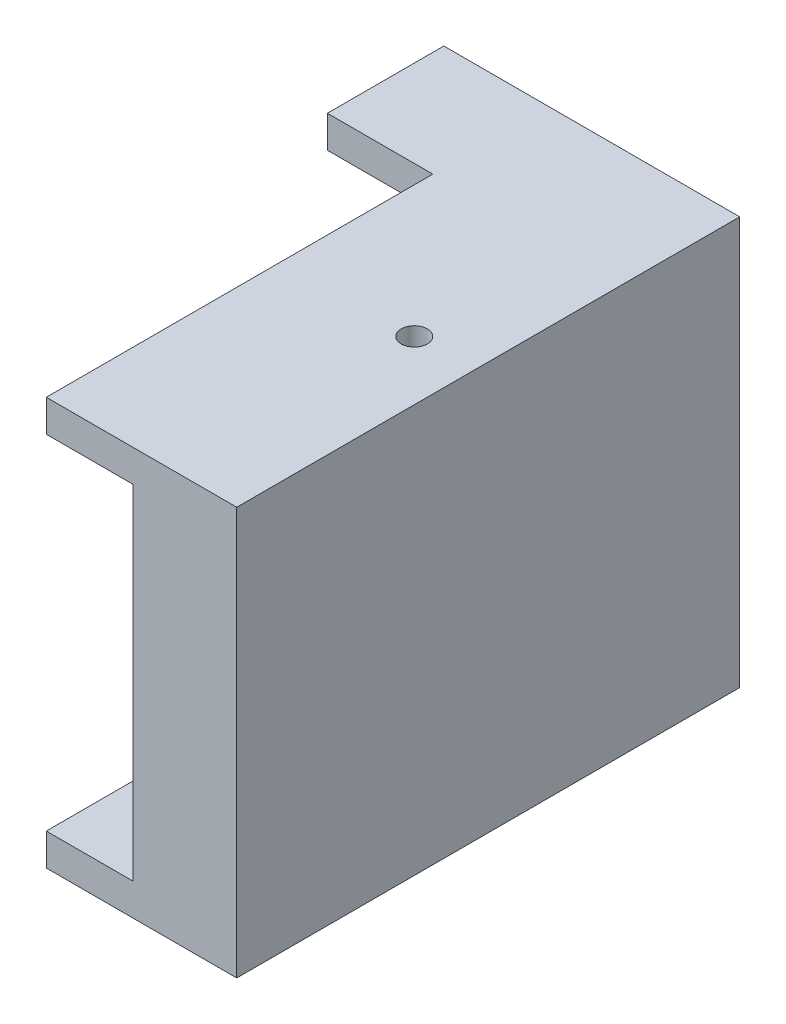
ISO-10303-21;
HEADER;
FILE_DESCRIPTION(('STEP AP214'),'2;1');
FILE_NAME('part.step','',(''),(''),'','','');
FILE_SCHEMA(('AUTOMOTIVE_DESIGN { 1 0 10303 214 1 1 1 1 }'));
ENDSEC;
DATA;
#1=APPLICATION_CONTEXT('core data for automotive mechanical design processes');
#2=APPLICATION_PROTOCOL_DEFINITION('international standard','automotive_design',2000,#1);
#3=PRODUCT_CONTEXT('',#1,'mechanical');
#4=PRODUCT('Part','Part','',(#3));
#5=PRODUCT_RELATED_PRODUCT_CATEGORY('part','',(#4));
#6=PRODUCT_DEFINITION_FORMATION('','',#4);
#7=PRODUCT_DEFINITION_CONTEXT('part definition',#1,'design');
#8=PRODUCT_DEFINITION('design','',#6,#7);
#9=PRODUCT_DEFINITION_SHAPE('','',#8);
#10=(LENGTH_UNIT() NAMED_UNIT(*) SI_UNIT(.MILLI.,.METRE.));
#11=(NAMED_UNIT(*) PLANE_ANGLE_UNIT() SI_UNIT($,.RADIAN.));
#12=(NAMED_UNIT(*) SI_UNIT($,.STERADIAN.) SOLID_ANGLE_UNIT());
#13=UNCERTAINTY_MEASURE_WITH_UNIT(LENGTH_MEASURE(1.E-05),#10,'distance_accuracy_value','');
#14=(GEOMETRIC_REPRESENTATION_CONTEXT(3) GLOBAL_UNCERTAINTY_ASSIGNED_CONTEXT((#13)) GLOBAL_UNIT_ASSIGNED_CONTEXT((#10,
#11,#12)) REPRESENTATION_CONTEXT('',''));
#15=CARTESIAN_POINT('',(0.,0.,0.));
#16=DIRECTION('',(0.,0.,1.));
#17=DIRECTION('',(1.,0.,0.));
#18=AXIS2_PLACEMENT_3D('',#15,#16,#17);
#19=CARTESIAN_POINT('',(-50.8,70.,20.));
#20=DIRECTION('',(0.,0.,-1.));
#21=DIRECTION('',(-1.,0.,0.));
#22=AXIS2_PLACEMENT_3D('',#19,#20,#21);
#23=PLANE('',#22);
#24=DIRECTION('',(0.,-1.,0.));
#25=VECTOR('',#24,1.);
#26=CARTESIAN_POINT('',(-32.7,70.,20.));
#27=LINE('',#26,#25);
#28=CARTESIAN_POINT('',(-32.7,5.50000000000001,20.));
#29=VERTEX_POINT('',#28);
#30=CARTESIAN_POINT('',(-32.7,0.,20.));
#31=VERTEX_POINT('',#30);
#32=EDGE_CURVE('E148',#29,#31,#27,.T.);
#33=ORIENTED_EDGE('',*,*,#32,.F.);
#34=DIRECTION('',(-1.,0.,0.));
#35=VECTOR('',#34,1.);
#36=CARTESIAN_POINT('',(-50.8,5.50000000000001,20.));
#37=LINE('',#36,#35);
#38=CARTESIAN_POINT('',(-50.8,5.50000000000001,20.));
#39=VERTEX_POINT('',#38);
#40=EDGE_CURVE('E134',#29,#39,#37,.T.);
#41=ORIENTED_EDGE('',*,*,#40,.T.);
#42=DIRECTION('',(0.,-1.,0.));
#43=VECTOR('',#42,1.);
#44=CARTESIAN_POINT('',(-50.8,70.,20.));
#45=LINE('',#44,#43);
#46=CARTESIAN_POINT('',(-50.8,0.,20.));
#47=VERTEX_POINT('',#46);
#48=EDGE_CURVE('E41',#39,#47,#45,.T.);
#49=ORIENTED_EDGE('',*,*,#48,.T.);
#50=DIRECTION('',(1.,0.,0.));
#51=VECTOR('',#50,1.);
#52=CARTESIAN_POINT('',(-50.8,0.,20.));
#53=LINE('',#52,#51);
#54=EDGE_CURVE('E133',#47,#31,#53,.T.);
#55=ORIENTED_EDGE('',*,*,#54,.T.);
#56=EDGE_LOOP('',(#33,#41,#49,#55));
#57=FACE_BOUND('',#56,.T.);
#58=ADVANCED_FACE('F33',(#57),#23,.F.);
#59=CARTESIAN_POINT('',(-32.7,70.,20.));
#60=DIRECTION('',(1.,0.,0.));
#61=DIRECTION('',(0.,0.,-1.));
#62=AXIS2_PLACEMENT_3D('',#59,#60,#61);
#63=PLANE('',#62);
#64=DIRECTION('',(0.,-1.,0.));
#65=VECTOR('',#64,1.);
#66=CARTESIAN_POINT('',(-32.7,70.,86.36));
#67=LINE('',#66,#65);
#68=CARTESIAN_POINT('',(-32.7,5.50000000000001,86.36));
#69=VERTEX_POINT('',#68);
#70=CARTESIAN_POINT('',(-32.7,0.,86.36));
#71=VERTEX_POINT('',#70);
#72=EDGE_CURVE('E121',#69,#71,#67,.T.);
#73=ORIENTED_EDGE('',*,*,#72,.F.);
#74=DIRECTION('',(0.,0.,-1.));
#75=VECTOR('',#74,1.);
#76=CARTESIAN_POINT('',(-32.7,5.50000000000001,20.));
#77=LINE('',#76,#75);
#78=EDGE_CURVE('E161',#69,#29,#77,.T.);
#79=ORIENTED_EDGE('',*,*,#78,.T.);
#80=ORIENTED_EDGE('',*,*,#32,.T.);
#81=DIRECTION('',(0.,0.,1.));
#82=VECTOR('',#81,1.);
#83=CARTESIAN_POINT('',(-32.7,0.,20.));
#84=LINE('',#83,#82);
#85=EDGE_CURVE('E137',#31,#71,#84,.T.);
#86=ORIENTED_EDGE('',*,*,#85,.T.);
#87=EDGE_LOOP('',(#73,#79,#80,#86));
#88=FACE_BOUND('',#87,.T.);
#89=ADVANCED_FACE('F158',(#88),#63,.F.);
#90=CARTESIAN_POINT('',(-50.8,70.,0.));
#91=DIRECTION('',(1.,0.,0.));
#92=DIRECTION('',(0.,0.,-1.));
#93=AXIS2_PLACEMENT_3D('',#90,#91,#92);
#94=PLANE('',#93);
#95=ORIENTED_EDGE('',*,*,#48,.F.);
#96=DIRECTION('',(0.,0.,1.));
#97=VECTOR('',#96,1.);
#98=CARTESIAN_POINT('',(-50.8,5.50000000000001,86.36));
#99=LINE('',#98,#97);
#100=CARTESIAN_POINT('',(-50.8,5.50000000000001,7.35999999999998));
#101=VERTEX_POINT('',#100);
#102=EDGE_CURVE('E196',#101,#39,#99,.T.);
#103=ORIENTED_EDGE('',*,*,#102,.F.);
#104=DIRECTION('',(0.,-1.,0.));
#105=VECTOR('',#104,1.);
#106=CARTESIAN_POINT('',(-50.8,64.5,7.35999999999998));
#107=LINE('',#106,#105);
#108=CARTESIAN_POINT('',(-50.8,64.5,7.35999999999998));
#109=VERTEX_POINT('',#108);
#110=EDGE_CURVE('E200',#109,#101,#107,.T.);
#111=ORIENTED_EDGE('',*,*,#110,.F.);
#112=DIRECTION('',(0.,0.,-1.));
#113=VECTOR('',#112,1.);
#114=CARTESIAN_POINT('',(-50.8,64.5,86.36));
#115=LINE('',#114,#113);
#116=CARTESIAN_POINT('',(-50.8,64.5,20.));
#117=VERTEX_POINT('',#116);
#118=EDGE_CURVE('E203',#117,#109,#115,.T.);
#119=ORIENTED_EDGE('',*,*,#118,.F.);
#120=CARTESIAN_POINT('',(-50.8,70.,20.));
#121=VERTEX_POINT('',#120);
#122=EDGE_CURVE('E11',#121,#117,#45,.T.);
#123=ORIENTED_EDGE('',*,*,#122,.F.);
#124=DIRECTION('',(0.,0.,1.));
#125=VECTOR('',#124,1.);
#126=CARTESIAN_POINT('',(-50.8,70.,0.));
#127=LINE('',#126,#125);
#128=CARTESIAN_POINT('',(-50.8,70.,0.));
#129=VERTEX_POINT('',#128);
#130=EDGE_CURVE('E144',#129,#121,#127,.T.);
#131=ORIENTED_EDGE('',*,*,#130,.F.);
#132=DIRECTION('',(0.,-1.,0.));
#133=VECTOR('',#132,1.);
#134=CARTESIAN_POINT('',(-50.8,70.,0.));
#135=LINE('',#134,#133);
#136=CARTESIAN_POINT('',(-50.8,0.,0.));
#137=VERTEX_POINT('',#136);
#138=EDGE_CURVE('E126',#129,#137,#135,.T.);
#139=ORIENTED_EDGE('',*,*,#138,.T.);
#140=DIRECTION('',(0.,0.,1.));
#141=VECTOR('',#140,1.);
#142=CARTESIAN_POINT('',(-50.8,0.,0.));
#143=LINE('',#142,#141);
#144=EDGE_CURVE('E130',#137,#47,#143,.T.);
#145=ORIENTED_EDGE('',*,*,#144,.T.);
#146=EDGE_LOOP('',(#95,#103,#111,#119,#123,#131,#139,#145));
#147=FACE_BOUND('',#146,.T.);
#148=ADVANCED_FACE('F35',(#147),#94,.F.);
#149=ORIENTED_EDGE('',*,*,#122,.T.);
#150=DIRECTION('',(1.,0.,0.));
#151=VECTOR('',#150,1.);
#152=CARTESIAN_POINT('',(-50.8,64.5,20.));
#153=LINE('',#152,#151);
#154=CARTESIAN_POINT('',(-32.7,64.5,20.));
#155=VERTEX_POINT('',#154);
#156=EDGE_CURVE('E179',#117,#155,#153,.T.);
#157=ORIENTED_EDGE('',*,*,#156,.T.);
#158=CARTESIAN_POINT('',(-32.7,70.,20.));
#159=VERTEX_POINT('',#158);
#160=EDGE_CURVE('E149',#159,#155,#27,.T.);
#161=ORIENTED_EDGE('',*,*,#160,.F.);
#162=DIRECTION('',(1.,0.,0.));
#163=VECTOR('',#162,1.);
#164=CARTESIAN_POINT('',(-50.8,70.,20.));
#165=LINE('',#164,#163);
#166=EDGE_CURVE('E92',#121,#159,#165,.T.);
#167=ORIENTED_EDGE('',*,*,#166,.F.);
#168=EDGE_LOOP('',(#149,#157,#161,#167));
#169=FACE_BOUND('',#168,.T.);
#170=ADVANCED_FACE('F239',(#169),#23,.F.);
#171=ORIENTED_EDGE('',*,*,#160,.T.);
#172=DIRECTION('',(0.,0.,1.));
#173=VECTOR('',#172,1.);
#174=CARTESIAN_POINT('',(-32.7,64.5,20.));
#175=LINE('',#174,#173);
#176=CARTESIAN_POINT('',(-32.7,64.5,86.36));
#177=VERTEX_POINT('',#176);
#178=EDGE_CURVE('E182',#155,#177,#175,.T.);
#179=ORIENTED_EDGE('',*,*,#178,.T.);
#180=CARTESIAN_POINT('',(-32.7,70.,86.36));
#181=VERTEX_POINT('',#180);
#182=EDGE_CURVE('E147',#181,#177,#67,.T.);
#183=ORIENTED_EDGE('',*,*,#182,.F.);
#184=DIRECTION('',(0.,0.,1.));
#185=VECTOR('',#184,1.);
#186=CARTESIAN_POINT('',(-32.7,70.,20.));
#187=LINE('',#186,#185);
#188=EDGE_CURVE('E108',#159,#181,#187,.T.);
#189=ORIENTED_EDGE('',*,*,#188,.F.);
#190=EDGE_LOOP('',(#171,#179,#183,#189));
#191=FACE_BOUND('',#190,.T.);
#192=ADVANCED_FACE('F244',(#191),#63,.F.);
#193=CARTESIAN_POINT('',(-32.7,70.,86.36));
#194=DIRECTION('',(0.,0.,-1.));
#195=DIRECTION('',(-1.,0.,0.));
#196=AXIS2_PLACEMENT_3D('',#193,#194,#195);
#197=PLANE('',#196);
#198=DIRECTION('',(0.,1.,0.));
#199=VECTOR('',#198,1.);
#200=CARTESIAN_POINT('',(-17.78,64.5,86.36));
#201=LINE('',#200,#199);
#202=CARTESIAN_POINT('',(-17.78,5.50000000000001,86.36));
#203=VERTEX_POINT('',#202);
#204=CARTESIAN_POINT('',(-17.78,64.5,86.36));
#205=VERTEX_POINT('',#204);
#206=EDGE_CURVE('E199',#203,#205,#201,.T.);
#207=ORIENTED_EDGE('',*,*,#206,.F.);
#208=DIRECTION('',(-1.,0.,0.));
#209=VECTOR('',#208,1.);
#210=CARTESIAN_POINT('',(-17.78,5.50000000000001,86.36));
#211=LINE('',#210,#209);
#212=EDGE_CURVE('E184',#203,#69,#211,.T.);
#213=ORIENTED_EDGE('',*,*,#212,.T.);
#214=ORIENTED_EDGE('',*,*,#72,.T.);
#215=DIRECTION('',(1.,0.,0.));
#216=VECTOR('',#215,1.);
#217=CARTESIAN_POINT('',(-32.7,0.,86.36));
#218=LINE('',#217,#216);
#219=CARTESIAN_POINT('',(0.,0.,86.36));
#220=VERTEX_POINT('',#219);
#221=EDGE_CURVE('E118',#71,#220,#218,.T.);
#222=ORIENTED_EDGE('',*,*,#221,.T.);
#223=DIRECTION('',(0.,-1.,0.));
#224=VECTOR('',#223,1.);
#225=CARTESIAN_POINT('',(0.,70.,86.36));
#226=LINE('',#225,#224);
#227=CARTESIAN_POINT('',(0.,70.,86.36));
#228=VERTEX_POINT('',#227);
#229=EDGE_CURVE('E114',#228,#220,#226,.T.);
#230=ORIENTED_EDGE('',*,*,#229,.F.);
#231=DIRECTION('',(1.,0.,0.));
#232=VECTOR('',#231,1.);
#233=CARTESIAN_POINT('',(-32.7,70.,86.36));
#234=LINE('',#233,#232);
#235=EDGE_CURVE('E101',#181,#228,#234,.T.);
#236=ORIENTED_EDGE('',*,*,#235,.F.);
#237=ORIENTED_EDGE('',*,*,#182,.T.);
#238=DIRECTION('',(-1.,0.,0.));
#239=VECTOR('',#238,1.);
#240=CARTESIAN_POINT('',(-17.78,64.5,86.36));
#241=LINE('',#240,#239);
#242=EDGE_CURVE('E185',#205,#177,#241,.T.);
#243=ORIENTED_EDGE('',*,*,#242,.F.);
#244=EDGE_LOOP('',(#207,#213,#214,#222,#230,#236,#237,#243));
#245=FACE_BOUND('',#244,.T.);
#246=ADVANCED_FACE('F116',(#245),#197,.F.);
#247=CARTESIAN_POINT('',(0.,70.,86.36));
#248=DIRECTION('',(-1.,0.,0.));
#249=DIRECTION('',(0.,0.,1.));
#250=AXIS2_PLACEMENT_3D('',#247,#248,#249);
#251=PLANE('',#250);
#252=DIRECTION('',(0.,0.,-1.));
#253=VECTOR('',#252,1.);
#254=CARTESIAN_POINT('',(0.,0.,86.36));
#255=LINE('',#254,#253);
#256=CARTESIAN_POINT('',(0.,0.,0.));
#257=VERTEX_POINT('',#256);
#258=EDGE_CURVE('E141',#220,#257,#255,.T.);
#259=ORIENTED_EDGE('',*,*,#258,.T.);
#260=DIRECTION('',(0.,-1.,0.));
#261=VECTOR('',#260,1.);
#262=CARTESIAN_POINT('',(0.,70.,0.));
#263=LINE('',#262,#261);
#264=CARTESIAN_POINT('',(0.,70.,0.));
#265=VERTEX_POINT('',#264);
#266=EDGE_CURVE('E122',#265,#257,#263,.T.);
#267=ORIENTED_EDGE('',*,*,#266,.F.);
#268=DIRECTION('',(0.,0.,-1.));
#269=VECTOR('',#268,1.);
#270=CARTESIAN_POINT('',(0.,70.,86.36));
#271=LINE('',#270,#269);
#272=EDGE_CURVE('E105',#228,#265,#271,.T.);
#273=ORIENTED_EDGE('',*,*,#272,.F.);
#274=ORIENTED_EDGE('',*,*,#229,.T.);
#275=EDGE_LOOP('',(#259,#267,#273,#274));
#276=FACE_BOUND('',#275,.T.);
#277=ADVANCED_FACE('F124',(#276),#251,.F.);
#278=CARTESIAN_POINT('',(0.,70.,0.));
#279=DIRECTION('',(0.,0.,1.));
#280=DIRECTION('',(1.,0.,0.));
#281=AXIS2_PLACEMENT_3D('',#278,#279,#280);
#282=PLANE('',#281);
#283=DIRECTION('',(-1.,0.,0.));
#284=VECTOR('',#283,1.);
#285=CARTESIAN_POINT('',(0.,0.,0.));
#286=LINE('',#285,#284);
#287=EDGE_CURVE('E84',#257,#137,#286,.T.);
#288=ORIENTED_EDGE('',*,*,#287,.T.);
#289=ORIENTED_EDGE('',*,*,#138,.F.);
#290=DIRECTION('',(-1.,0.,0.));
#291=VECTOR('',#290,1.);
#292=CARTESIAN_POINT('',(0.,70.,0.));
#293=LINE('',#292,#291);
#294=EDGE_CURVE('E57',#265,#129,#293,.T.);
#295=ORIENTED_EDGE('',*,*,#294,.F.);
#296=ORIENTED_EDGE('',*,*,#266,.T.);
#297=EDGE_LOOP('',(#288,#289,#295,#296));
#298=FACE_BOUND('',#297,.T.);
#299=ADVANCED_FACE('F169',(#298),#282,.F.);
#300=CARTESIAN_POINT('',(0.,70.,0.));
#301=DIRECTION('',(0.,1.,0.));
#302=DIRECTION('',(0.,0.,1.));
#303=AXIS2_PLACEMENT_3D('',#300,#301,#302);
#304=PLANE('',#303);
#305=CARTESIAN_POINT('',(-10.16,70.,45.72));
#306=DIRECTION('',(0.,1.,0.));
#307=DIRECTION('',(0.,0.,1.));
#308=AXIS2_PLACEMENT_3D('',#305,#306,#307);
#309=CIRCLE('',#308,2.2479);
#310=CARTESIAN_POINT('',(-10.16,70.,47.9679));
#311=VERTEX_POINT('',#310);
#312=EDGE_CURVE('E214',#311,#311,#309,.T.);
#313=ORIENTED_EDGE('',*,*,#312,.F.);
#314=EDGE_LOOP('',(#313));
#315=FACE_BOUND('',#314,.T.);
#316=ORIENTED_EDGE('',*,*,#130,.T.);
#317=ORIENTED_EDGE('',*,*,#166,.T.);
#318=ORIENTED_EDGE('',*,*,#188,.T.);
#319=ORIENTED_EDGE('',*,*,#235,.T.);
#320=ORIENTED_EDGE('',*,*,#272,.T.);
#321=ORIENTED_EDGE('',*,*,#294,.T.);
#322=EDGE_LOOP('',(#316,#317,#318,#319,#320,#321));
#323=FACE_BOUND('',#322,.T.);
#324=ADVANCED_FACE('F103',(#315,#323),#304,.T.);
#325=CARTESIAN_POINT('',(0.,0.,0.));
#326=DIRECTION('',(0.,1.,0.));
#327=DIRECTION('',(0.,0.,1.));
#328=AXIS2_PLACEMENT_3D('',#325,#326,#327);
#329=PLANE('',#328);
#330=CARTESIAN_POINT('',(-10.16,0.,45.72));
#331=DIRECTION('',(0.,1.,0.));
#332=DIRECTION('',(0.,0.,1.));
#333=AXIS2_PLACEMENT_3D('',#330,#331,#332);
#334=CIRCLE('',#333,2.2479);
#335=CARTESIAN_POINT('',(-10.16,0.,47.9679));
#336=VERTEX_POINT('',#335);
#337=EDGE_CURVE('E206',#336,#336,#334,.T.);
#338=ORIENTED_EDGE('',*,*,#337,.T.);
#339=EDGE_LOOP('',(#338));
#340=FACE_BOUND('',#339,.T.);
#341=ORIENTED_EDGE('',*,*,#144,.F.);
#342=ORIENTED_EDGE('',*,*,#287,.F.);
#343=ORIENTED_EDGE('',*,*,#258,.F.);
#344=ORIENTED_EDGE('',*,*,#221,.F.);
#345=ORIENTED_EDGE('',*,*,#85,.F.);
#346=ORIENTED_EDGE('',*,*,#54,.F.);
#347=EDGE_LOOP('',(#341,#342,#343,#344,#345,#346));
#348=FACE_BOUND('',#347,.T.);
#349=ADVANCED_FACE('F168',(#340,#348),#329,.F.);
#350=CARTESIAN_POINT('',(-17.78,5.50000000000001,86.36));
#351=DIRECTION('',(0.,-1.,0.));
#352=DIRECTION('',(0.,0.,-1.));
#353=AXIS2_PLACEMENT_3D('',#350,#351,#352);
#354=PLANE('',#353);
#355=ORIENTED_EDGE('',*,*,#78,.F.);
#356=ORIENTED_EDGE('',*,*,#212,.F.);
#357=DIRECTION('',(0.,0.,1.));
#358=VECTOR('',#357,1.);
#359=CARTESIAN_POINT('',(-17.78,5.50000000000001,86.36));
#360=LINE('',#359,#358);
#361=CARTESIAN_POINT('',(-17.78,5.50000000000001,7.35999999999997));
#362=VERTEX_POINT('',#361);
#363=EDGE_CURVE('E48',#362,#203,#360,.T.);
#364=ORIENTED_EDGE('',*,*,#363,.F.);
#365=DIRECTION('',(-1.,0.,0.));
#366=VECTOR('',#365,1.);
#367=CARTESIAN_POINT('',(-17.78,5.50000000000001,7.35999999999997));
#368=LINE('',#367,#366);
#369=EDGE_CURVE('E191',#362,#101,#368,.T.);
#370=ORIENTED_EDGE('',*,*,#369,.T.);
#371=ORIENTED_EDGE('',*,*,#102,.T.);
#372=ORIENTED_EDGE('',*,*,#40,.F.);
#373=EDGE_LOOP('',(#355,#356,#364,#370,#371,#372));
#374=FACE_BOUND('',#373,.T.);
#375=ADVANCED_FACE('F234',(#374),#354,.F.);
#376=CARTESIAN_POINT('',(-17.78,64.5,86.36));
#377=DIRECTION('',(0.,1.,0.));
#378=DIRECTION('',(0.,0.,1.));
#379=AXIS2_PLACEMENT_3D('',#376,#377,#378);
#380=PLANE('',#379);
#381=ORIENTED_EDGE('',*,*,#118,.T.);
#382=DIRECTION('',(-1.,0.,0.));
#383=VECTOR('',#382,1.);
#384=CARTESIAN_POINT('',(-17.78,64.5,7.35999999999997));
#385=LINE('',#384,#383);
#386=CARTESIAN_POINT('',(-17.78,64.5,7.35999999999997));
#387=VERTEX_POINT('',#386);
#388=EDGE_CURVE('E188',#387,#109,#385,.T.);
#389=ORIENTED_EDGE('',*,*,#388,.F.);
#390=DIRECTION('',(0.,0.,-1.));
#391=VECTOR('',#390,1.);
#392=CARTESIAN_POINT('',(-17.78,64.5,86.36));
#393=LINE('',#392,#391);
#394=EDGE_CURVE('E210',#205,#387,#393,.T.);
#395=ORIENTED_EDGE('',*,*,#394,.F.);
#396=ORIENTED_EDGE('',*,*,#242,.T.);
#397=ORIENTED_EDGE('',*,*,#178,.F.);
#398=ORIENTED_EDGE('',*,*,#156,.F.);
#399=EDGE_LOOP('',(#381,#389,#395,#396,#397,#398));
#400=FACE_BOUND('',#399,.T.);
#401=ADVANCED_FACE('F279',(#400),#380,.F.);
#402=CARTESIAN_POINT('',(-17.78,64.5,7.35999999999997));
#403=DIRECTION('',(0.,0.,-1.));
#404=DIRECTION('',(-1.,0.,0.));
#405=AXIS2_PLACEMENT_3D('',#402,#403,#404);
#406=PLANE('',#405);
#407=ORIENTED_EDGE('',*,*,#110,.T.);
#408=ORIENTED_EDGE('',*,*,#369,.F.);
#409=DIRECTION('',(0.,-1.,0.));
#410=VECTOR('',#409,1.);
#411=CARTESIAN_POINT('',(-17.78,64.5,7.35999999999997));
#412=LINE('',#411,#410);
#413=EDGE_CURVE('E208',#387,#362,#412,.T.);
#414=ORIENTED_EDGE('',*,*,#413,.F.);
#415=ORIENTED_EDGE('',*,*,#388,.T.);
#416=EDGE_LOOP('',(#407,#408,#414,#415));
#417=FACE_BOUND('',#416,.T.);
#418=ADVANCED_FACE('F281',(#417),#406,.F.);
#419=CARTESIAN_POINT('',(-17.78,0.,0.));
#420=DIRECTION('',(1.,0.,0.));
#421=DIRECTION('',(0.,0.,-1.));
#422=AXIS2_PLACEMENT_3D('',#419,#420,#421);
#423=PLANE('',#422);
#424=ORIENTED_EDGE('',*,*,#206,.T.);
#425=ORIENTED_EDGE('',*,*,#394,.T.);
#426=ORIENTED_EDGE('',*,*,#413,.T.);
#427=ORIENTED_EDGE('',*,*,#363,.T.);
#428=EDGE_LOOP('',(#424,#425,#426,#427));
#429=FACE_BOUND('',#428,.T.);
#430=ADVANCED_FACE('F224',(#429),#423,.F.);
#431=CARTESIAN_POINT('',(-10.16,0.,45.72));
#432=DIRECTION('',(0.,1.,0.));
#433=DIRECTION('',(0.,0.,1.));
#434=AXIS2_PLACEMENT_3D('',#431,#432,#433);
#435=CYLINDRICAL_SURFACE('',#434,2.2479);
#436=ORIENTED_EDGE('',*,*,#337,.F.);
#437=EDGE_LOOP('',(#436));
#438=FACE_BOUND('',#437,.T.);
#439=ORIENTED_EDGE('',*,*,#312,.T.);
#440=EDGE_LOOP('',(#439));
#441=FACE_BOUND('',#440,.T.);
#442=ADVANCED_FACE('F221',(#438,#441),#435,.F.);
#443=CLOSED_SHELL('',(#58,#89,#148,#170,#192,#246,#277,#299,#324,#349,#375,#401,#418,#430,#442));
#444=MANIFOLD_SOLID_BREP('B2',#443);
#445=ADVANCED_BREP_SHAPE_REPRESENTATION('',(#18,#444),#14);
#446=SHAPE_DEFINITION_REPRESENTATION(#9,#445);
ENDSEC;
END-ISO-10303-21;
